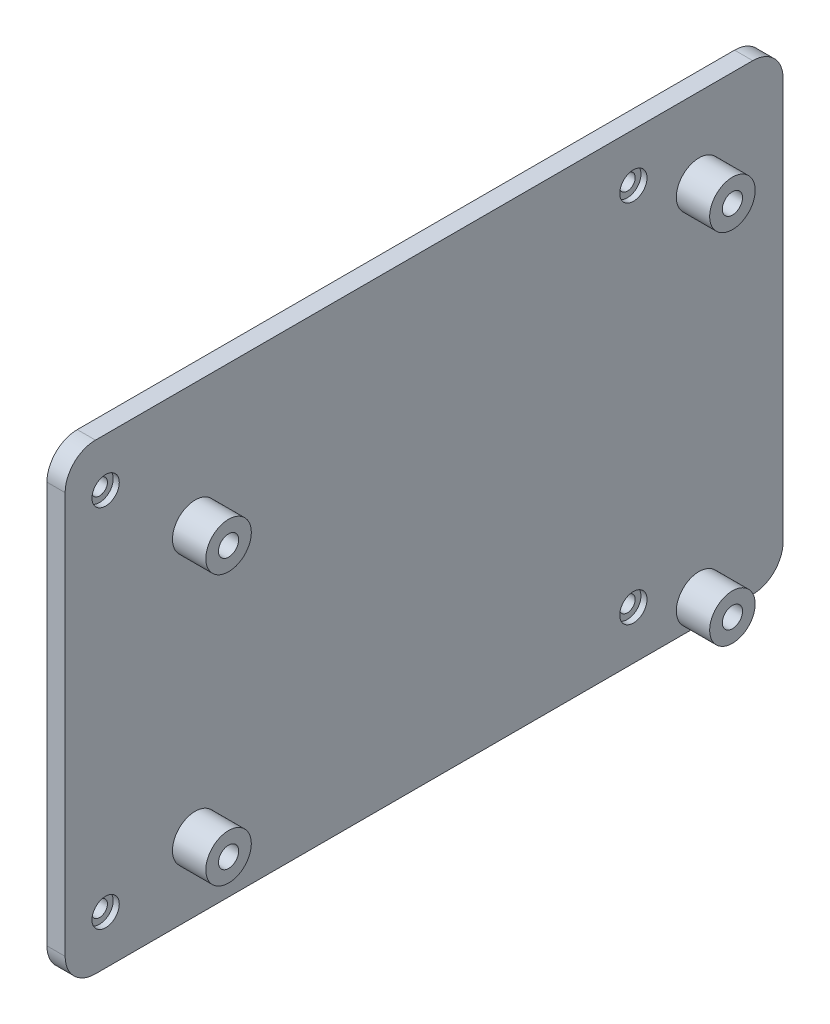
ISO-10303-21;
HEADER;
FILE_DESCRIPTION(('STEP AP214'),'2;1');
FILE_NAME('part.step','',(''),(''),'','','');
FILE_SCHEMA(('AUTOMOTIVE_DESIGN { 1 0 10303 214 1 1 1 1 }'));
ENDSEC;
DATA;
#1=APPLICATION_CONTEXT('core data for automotive mechanical design processes');
#2=APPLICATION_PROTOCOL_DEFINITION('international standard','automotive_design',2000,#1);
#3=PRODUCT_CONTEXT('',#1,'mechanical');
#4=PRODUCT('Part','Part','',(#3));
#5=PRODUCT_RELATED_PRODUCT_CATEGORY('part','',(#4));
#6=PRODUCT_DEFINITION_FORMATION('','',#4);
#7=PRODUCT_DEFINITION_CONTEXT('part definition',#1,'design');
#8=PRODUCT_DEFINITION('design','',#6,#7);
#9=PRODUCT_DEFINITION_SHAPE('','',#8);
#10=(LENGTH_UNIT() NAMED_UNIT(*) SI_UNIT(.MILLI.,.METRE.));
#11=(NAMED_UNIT(*) PLANE_ANGLE_UNIT() SI_UNIT($,.RADIAN.));
#12=(NAMED_UNIT(*) SI_UNIT($,.STERADIAN.) SOLID_ANGLE_UNIT());
#13=UNCERTAINTY_MEASURE_WITH_UNIT(LENGTH_MEASURE(1.E-05),#10,'distance_accuracy_value','');
#14=(GEOMETRIC_REPRESENTATION_CONTEXT(3) GLOBAL_UNCERTAINTY_ASSIGNED_CONTEXT((#13)) GLOBAL_UNIT_ASSIGNED_CONTEXT((#10,
#11,#12)) REPRESENTATION_CONTEXT('',''));
#15=CARTESIAN_POINT('',(0.,0.,0.));
#16=DIRECTION('',(0.,0.,1.));
#17=DIRECTION('',(1.,0.,0.));
#18=AXIS2_PLACEMENT_3D('',#15,#16,#17);
#19=CARTESIAN_POINT('',(3.,-30.0999999999989,-42.0000000000002));
#20=DIRECTION('',(1.,0.,0.));
#21=DIRECTION('',(0.,0.,-1.));
#22=AXIS2_PLACEMENT_3D('',#19,#20,#21);
#23=CYLINDRICAL_SURFACE('',#22,1.3);
#24=CARTESIAN_POINT('',(0.,-30.0999999999989,-42.0000000000002));
#25=DIRECTION('',(1.,0.,0.));
#26=DIRECTION('',(0.,0.,-1.));
#27=AXIS2_PLACEMENT_3D('',#24,#25,#26);
#28=CIRCLE('',#27,1.3);
#29=CARTESIAN_POINT('',(0.,-30.0999999999989,-43.3000000000002));
#30=VERTEX_POINT('',#29);
#31=EDGE_CURVE('E131',#30,#30,#28,.T.);
#32=ORIENTED_EDGE('',*,*,#31,.F.);
#33=EDGE_LOOP('',(#32));
#34=FACE_BOUND('',#33,.T.);
#35=CARTESIAN_POINT('',(2.,-30.0999999999989,-42.0000000000002));
#36=DIRECTION('',(1.,0.,0.));
#37=DIRECTION('',(0.,0.,-1.));
#38=AXIS2_PLACEMENT_3D('',#35,#36,#37);
#39=CIRCLE('',#38,1.3);
#40=CARTESIAN_POINT('',(2.,-30.0999999999989,-43.3000000000002));
#41=VERTEX_POINT('',#40);
#42=EDGE_CURVE('E40',#41,#41,#39,.F.);
#43=ORIENTED_EDGE('',*,*,#42,.F.);
#44=EDGE_LOOP('',(#43));
#45=FACE_BOUND('',#44,.T.);
#46=ADVANCED_FACE('F36',(#34,#45),#23,.F.);
#47=CARTESIAN_POINT('',(3.,30.1000000000011,-42.0000000000002));
#48=DIRECTION('',(1.,0.,0.));
#49=DIRECTION('',(0.,0.,-1.));
#50=AXIS2_PLACEMENT_3D('',#47,#48,#49);
#51=CYLINDRICAL_SURFACE('',#50,1.3);
#52=CARTESIAN_POINT('',(0.,30.1000000000011,-42.0000000000002));
#53=DIRECTION('',(1.,0.,0.));
#54=DIRECTION('',(0.,0.,-1.));
#55=AXIS2_PLACEMENT_3D('',#52,#53,#54);
#56=CIRCLE('',#55,1.3);
#57=CARTESIAN_POINT('',(0.,30.1000000000011,-43.3000000000002));
#58=VERTEX_POINT('',#57);
#59=EDGE_CURVE('E137',#58,#58,#56,.T.);
#60=ORIENTED_EDGE('',*,*,#59,.F.);
#61=EDGE_LOOP('',(#60));
#62=FACE_BOUND('',#61,.T.);
#63=CARTESIAN_POINT('',(2.,30.1000000000011,-42.0000000000002));
#64=DIRECTION('',(1.,0.,0.));
#65=DIRECTION('',(0.,0.,-1.));
#66=AXIS2_PLACEMENT_3D('',#63,#64,#65);
#67=CIRCLE('',#66,1.3);
#68=CARTESIAN_POINT('',(2.,30.1000000000011,-43.3000000000002));
#69=VERTEX_POINT('',#68);
#70=EDGE_CURVE('E182',#69,#69,#67,.F.);
#71=ORIENTED_EDGE('',*,*,#70,.F.);
#72=EDGE_LOOP('',(#71));
#73=FACE_BOUND('',#72,.T.);
#74=ADVANCED_FACE('F271',(#62,#73),#51,.F.);
#75=CARTESIAN_POINT('',(3.,30.1000000000011,44.9999999999998));
#76=DIRECTION('',(1.,0.,0.));
#77=DIRECTION('',(0.,0.,-1.));
#78=AXIS2_PLACEMENT_3D('',#75,#76,#77);
#79=CYLINDRICAL_SURFACE('',#78,1.3);
#80=CARTESIAN_POINT('',(0.,30.1000000000011,44.9999999999998));
#81=DIRECTION('',(1.,0.,0.));
#82=DIRECTION('',(0.,0.,-1.));
#83=AXIS2_PLACEMENT_3D('',#80,#81,#82);
#84=CIRCLE('',#83,1.3);
#85=CARTESIAN_POINT('',(0.,30.1000000000011,43.6999999999998));
#86=VERTEX_POINT('',#85);
#87=EDGE_CURVE('E238',#86,#86,#84,.T.);
#88=ORIENTED_EDGE('',*,*,#87,.F.);
#89=EDGE_LOOP('',(#88));
#90=FACE_BOUND('',#89,.T.);
#91=CARTESIAN_POINT('',(2.,30.1000000000011,44.9999999999998));
#92=DIRECTION('',(1.,0.,0.));
#93=DIRECTION('',(0.,0.,-1.));
#94=AXIS2_PLACEMENT_3D('',#91,#92,#93);
#95=CIRCLE('',#94,1.3);
#96=CARTESIAN_POINT('',(2.,30.1000000000011,43.6999999999998));
#97=VERTEX_POINT('',#96);
#98=EDGE_CURVE('E179',#97,#97,#95,.F.);
#99=ORIENTED_EDGE('',*,*,#98,.F.);
#100=EDGE_LOOP('',(#99));
#101=FACE_BOUND('',#100,.T.);
#102=ADVANCED_FACE('F277',(#90,#101),#79,.F.);
#103=CARTESIAN_POINT('',(3.,-30.0999999999989,44.9999999999998));
#104=DIRECTION('',(1.,0.,0.));
#105=DIRECTION('',(0.,0.,-1.));
#106=AXIS2_PLACEMENT_3D('',#103,#104,#105);
#107=CYLINDRICAL_SURFACE('',#106,1.3);
#108=CARTESIAN_POINT('',(0.,-30.0999999999989,44.9999999999998));
#109=DIRECTION('',(1.,0.,0.));
#110=DIRECTION('',(0.,0.,-1.));
#111=AXIS2_PLACEMENT_3D('',#108,#109,#110);
#112=CIRCLE('',#111,1.3);
#113=CARTESIAN_POINT('',(0.,-30.0999999999989,43.6999999999998));
#114=VERTEX_POINT('',#113);
#115=EDGE_CURVE('E233',#114,#114,#112,.T.);
#116=ORIENTED_EDGE('',*,*,#115,.F.);
#117=EDGE_LOOP('',(#116));
#118=FACE_BOUND('',#117,.T.);
#119=CARTESIAN_POINT('',(2.,-30.0999999999989,44.9999999999998));
#120=DIRECTION('',(1.,0.,0.));
#121=DIRECTION('',(0.,0.,-1.));
#122=AXIS2_PLACEMENT_3D('',#119,#120,#121);
#123=CIRCLE('',#122,1.3);
#124=CARTESIAN_POINT('',(2.,-30.0999999999989,43.6999999999998));
#125=VERTEX_POINT('',#124);
#126=EDGE_CURVE('E176',#125,#125,#123,.F.);
#127=ORIENTED_EDGE('',*,*,#126,.F.);
#128=EDGE_LOOP('',(#127));
#129=FACE_BOUND('',#128,.T.);
#130=ADVANCED_FACE('F298',(#118,#129),#107,.F.);
#131=CARTESIAN_POINT('',(3.,38.1,-66.675));
#132=DIRECTION('',(0.,0.,1.));
#133=DIRECTION('',(1.,0.,0.));
#134=AXIS2_PLACEMENT_3D('',#131,#132,#133);
#135=PLANE('',#134);
#136=DIRECTION('',(0.,1.,0.));
#137=VECTOR('',#136,1.);
#138=CARTESIAN_POINT('',(3.,38.1,-66.675));
#139=LINE('',#138,#137);
#140=CARTESIAN_POINT('',(3.,-33.1,-66.675));
#141=VERTEX_POINT('',#140);
#142=CARTESIAN_POINT('',(3.,33.1,-66.675));
#143=VERTEX_POINT('',#142);
#144=EDGE_CURVE('E124',#141,#143,#139,.T.);
#145=ORIENTED_EDGE('',*,*,#144,.F.);
#146=DIRECTION('',(-1.,0.,0.));
#147=VECTOR('',#146,1.);
#148=CARTESIAN_POINT('',(3.,-33.1,-66.675));
#149=LINE('',#148,#147);
#150=CARTESIAN_POINT('',(0.,-33.1,-66.675));
#151=VERTEX_POINT('',#150);
#152=EDGE_CURVE('E109',#141,#151,#149,.T.);
#153=ORIENTED_EDGE('',*,*,#152,.T.);
#154=DIRECTION('',(0.,1.,0.));
#155=VECTOR('',#154,1.);
#156=CARTESIAN_POINT('',(0.,38.1,-66.675));
#157=LINE('',#156,#155);
#158=CARTESIAN_POINT('',(0.,33.1,-66.675));
#159=VERTEX_POINT('',#158);
#160=EDGE_CURVE('E122',#151,#159,#157,.T.);
#161=ORIENTED_EDGE('',*,*,#160,.T.);
#162=DIRECTION('',(-1.,0.,0.));
#163=VECTOR('',#162,1.);
#164=CARTESIAN_POINT('',(3.,33.1,-66.675));
#165=LINE('',#164,#163);
#166=EDGE_CURVE('E126',#159,#143,#165,.F.);
#167=ORIENTED_EDGE('',*,*,#166,.T.);
#168=EDGE_LOOP('',(#145,#153,#161,#167));
#169=FACE_BOUND('',#168,.T.);
#170=ADVANCED_FACE('F121',(#169),#135,.F.);
#171=CARTESIAN_POINT('',(3.,38.1,66.675));
#172=DIRECTION('',(0.,-1.,0.));
#173=DIRECTION('',(0.,0.,-1.));
#174=AXIS2_PLACEMENT_3D('',#171,#172,#173);
#175=PLANE('',#174);
#176=DIRECTION('',(0.,0.,1.));
#177=VECTOR('',#176,1.);
#178=CARTESIAN_POINT('',(3.,38.1,66.675));
#179=LINE('',#178,#177);
#180=CARTESIAN_POINT('',(3.,38.1,-61.675));
#181=VERTEX_POINT('',#180);
#182=CARTESIAN_POINT('',(3.,38.1,46.675));
#183=VERTEX_POINT('',#182);
#184=EDGE_CURVE('E243',#181,#183,#179,.T.);
#185=ORIENTED_EDGE('',*,*,#184,.F.);
#186=DIRECTION('',(-1.,0.,0.));
#187=VECTOR('',#186,1.);
#188=CARTESIAN_POINT('',(3.,38.1,-61.675));
#189=LINE('',#188,#187);
#190=CARTESIAN_POINT('',(0.,38.1,-61.675));
#191=VERTEX_POINT('',#190);
#192=EDGE_CURVE('E171',#181,#191,#189,.T.);
#193=ORIENTED_EDGE('',*,*,#192,.T.);
#194=DIRECTION('',(0.,0.,1.));
#195=VECTOR('',#194,1.);
#196=CARTESIAN_POINT('',(0.,38.1,66.675));
#197=LINE('',#196,#195);
#198=CARTESIAN_POINT('',(0.,38.1,46.675));
#199=VERTEX_POINT('',#198);
#200=EDGE_CURVE('E130',#191,#199,#197,.T.);
#201=ORIENTED_EDGE('',*,*,#200,.T.);
#202=DIRECTION('',(1.,0.,0.));
#203=VECTOR('',#202,1.);
#204=CARTESIAN_POINT('',(3.,38.1,46.675));
#205=LINE('',#204,#203);
#206=EDGE_CURVE('E169',#199,#183,#205,.T.);
#207=ORIENTED_EDGE('',*,*,#206,.T.);
#208=EDGE_LOOP('',(#185,#193,#201,#207));
#209=FACE_BOUND('',#208,.T.);
#210=ADVANCED_FACE('F259',(#209),#175,.F.);
#211=CARTESIAN_POINT('',(3.,-38.1,66.675));
#212=DIRECTION('',(0.,1.,0.));
#213=DIRECTION('',(0.,0.,1.));
#214=AXIS2_PLACEMENT_3D('',#211,#212,#213);
#215=PLANE('',#214);
#216=DIRECTION('',(0.,0.,-1.));
#217=VECTOR('',#216,1.);
#218=CARTESIAN_POINT('',(0.,-38.1,66.675));
#219=LINE('',#218,#217);
#220=CARTESIAN_POINT('',(0.,-38.1,46.675));
#221=VERTEX_POINT('',#220);
#222=CARTESIAN_POINT('',(0.,-38.1,-61.675));
#223=VERTEX_POINT('',#222);
#224=EDGE_CURVE('E134',#221,#223,#219,.T.);
#225=ORIENTED_EDGE('',*,*,#224,.T.);
#226=DIRECTION('',(-1.,0.,0.));
#227=VECTOR('',#226,1.);
#228=CARTESIAN_POINT('',(3.,-38.1,-61.675));
#229=LINE('',#228,#227);
#230=CARTESIAN_POINT('',(3.,-38.1,-61.675));
#231=VERTEX_POINT('',#230);
#232=EDGE_CURVE('E110',#223,#231,#229,.F.);
#233=ORIENTED_EDGE('',*,*,#232,.T.);
#234=DIRECTION('',(0.,0.,-1.));
#235=VECTOR('',#234,1.);
#236=CARTESIAN_POINT('',(3.,-38.1,66.675));
#237=LINE('',#236,#235);
#238=CARTESIAN_POINT('',(3.,-38.1,46.675));
#239=VERTEX_POINT('',#238);
#240=EDGE_CURVE('E140',#239,#231,#237,.T.);
#241=ORIENTED_EDGE('',*,*,#240,.F.);
#242=DIRECTION('',(1.,0.,0.));
#243=VECTOR('',#242,1.);
#244=CARTESIAN_POINT('',(3.,-38.1,46.675));
#245=LINE('',#244,#243);
#246=EDGE_CURVE('E115',#239,#221,#245,.F.);
#247=ORIENTED_EDGE('',*,*,#246,.T.);
#248=EDGE_LOOP('',(#225,#233,#241,#247));
#249=FACE_BOUND('',#248,.T.);
#250=ADVANCED_FACE('F250',(#249),#215,.F.);
#251=CARTESIAN_POINT('',(3.,0.,0.));
#252=DIRECTION('',(1.,0.,0.));
#253=DIRECTION('',(0.,0.,-1.));
#254=AXIS2_PLACEMENT_3D('',#251,#252,#253);
#255=PLANE('',#254);
#256=CARTESIAN_POINT('',(3.,-30.0999999999989,-42.0000000000002));
#257=DIRECTION('',(1.,0.,0.));
#258=DIRECTION('',(0.,0.,-1.));
#259=AXIS2_PLACEMENT_3D('',#256,#257,#258);
#260=CIRCLE('',#259,2.25);
#261=CARTESIAN_POINT('',(3.,-30.0999999999989,-44.2500000000002));
#262=VERTEX_POINT('',#261);
#263=EDGE_CURVE('E417',#262,#262,#260,.T.);
#264=ORIENTED_EDGE('',*,*,#263,.F.);
#265=EDGE_LOOP('',(#264));
#266=FACE_BOUND('',#265,.T.);
#267=CARTESIAN_POINT('',(3.,30.1000000000011,-42.0000000000002));
#268=DIRECTION('',(1.,0.,0.));
#269=DIRECTION('',(0.,0.,-1.));
#270=AXIS2_PLACEMENT_3D('',#267,#268,#269);
#271=CIRCLE('',#270,2.25);
#272=CARTESIAN_POINT('',(3.,30.1000000000011,-44.2500000000002));
#273=VERTEX_POINT('',#272);
#274=EDGE_CURVE('E411',#273,#273,#271,.T.);
#275=ORIENTED_EDGE('',*,*,#274,.F.);
#276=EDGE_LOOP('',(#275));
#277=FACE_BOUND('',#276,.T.);
#278=CARTESIAN_POINT('',(3.,30.1000000000011,44.9999999999998));
#279=DIRECTION('',(1.,0.,0.));
#280=DIRECTION('',(0.,0.,-1.));
#281=AXIS2_PLACEMENT_3D('',#278,#279,#280);
#282=CIRCLE('',#281,2.25);
#283=CARTESIAN_POINT('',(3.,30.1000000000011,42.7499999999998));
#284=VERTEX_POINT('',#283);
#285=EDGE_CURVE('E402',#284,#284,#282,.T.);
#286=ORIENTED_EDGE('',*,*,#285,.F.);
#287=EDGE_LOOP('',(#286));
#288=FACE_BOUND('',#287,.T.);
#289=CARTESIAN_POINT('',(3.,-30.0999999999989,44.9999999999998));
#290=DIRECTION('',(1.,0.,0.));
#291=DIRECTION('',(0.,0.,-1.));
#292=AXIS2_PLACEMENT_3D('',#289,#290,#291);
#293=CIRCLE('',#292,2.25);
#294=CARTESIAN_POINT('',(3.,-30.0999999999989,42.7499999999998));
#295=VERTEX_POINT('',#294);
#296=EDGE_CURVE('E401',#295,#295,#293,.T.);
#297=ORIENTED_EDGE('',*,*,#296,.F.);
#298=EDGE_LOOP('',(#297));
#299=FACE_BOUND('',#298,.T.);
#300=ORIENTED_EDGE('',*,*,#240,.T.);
#301=CARTESIAN_POINT('',(3.,-33.1,-61.675));
#302=DIRECTION('',(1.,0.,0.));
#303=DIRECTION('',(0.,0.,-1.));
#304=AXIS2_PLACEMENT_3D('',#301,#302,#303);
#305=CIRCLE('',#304,5.);
#306=EDGE_CURVE('E167',#231,#141,#305,.T.);
#307=ORIENTED_EDGE('',*,*,#306,.T.);
#308=ORIENTED_EDGE('',*,*,#144,.T.);
#309=CARTESIAN_POINT('',(3.,33.1,-61.675));
#310=DIRECTION('',(1.,0.,0.));
#311=DIRECTION('',(0.,0.,-1.));
#312=AXIS2_PLACEMENT_3D('',#309,#310,#311);
#313=CIRCLE('',#312,5.);
#314=EDGE_CURVE('E61',#143,#181,#313,.T.);
#315=ORIENTED_EDGE('',*,*,#314,.T.);
#316=ORIENTED_EDGE('',*,*,#184,.T.);
#317=CARTESIAN_POINT('',(3.,33.1,46.675));
#318=DIRECTION('',(1.,0.,0.));
#319=DIRECTION('',(0.,0.,-1.));
#320=AXIS2_PLACEMENT_3D('',#317,#318,#319);
#321=CIRCLE('',#320,5.);
#322=CARTESIAN_POINT('',(3.,33.1,51.675));
#323=VERTEX_POINT('',#322);
#324=EDGE_CURVE('E53',#183,#323,#321,.T.);
#325=ORIENTED_EDGE('',*,*,#324,.T.);
#326=DIRECTION('',(0.,1.,0.));
#327=VECTOR('',#326,1.);
#328=CARTESIAN_POINT('',(3.,0.,51.675));
#329=LINE('',#328,#327);
#330=CARTESIAN_POINT('',(3.,-33.1,51.675));
#331=VERTEX_POINT('',#330);
#332=EDGE_CURVE('E187',#331,#323,#329,.T.);
#333=ORIENTED_EDGE('',*,*,#332,.F.);
#334=CARTESIAN_POINT('',(3.,-33.1,46.675));
#335=DIRECTION('',(1.,0.,0.));
#336=DIRECTION('',(0.,0.,-1.));
#337=AXIS2_PLACEMENT_3D('',#334,#335,#336);
#338=CIRCLE('',#337,5.);
#339=EDGE_CURVE('E163',#331,#239,#338,.T.);
#340=ORIENTED_EDGE('',*,*,#339,.T.);
#341=EDGE_LOOP('',(#300,#307,#308,#315,#316,#325,#333,#340));
#342=FACE_BOUND('',#341,.T.);
#343=CARTESIAN_POINT('',(3.,-26.854999995946,30.2315030100667));
#344=DIRECTION('',(1.,0.,0.));
#345=DIRECTION('',(0.,0.,-1.));
#346=AXIS2_PLACEMENT_3D('',#343,#344,#345);
#347=CIRCLE('',#346,3.75000000000028);
#348=CARTESIAN_POINT('',(3.,-26.854999995946,26.4815030100664));
#349=VERTEX_POINT('',#348);
#350=EDGE_CURVE('E196',#349,#349,#347,.T.);
#351=ORIENTED_EDGE('',*,*,#350,.F.);
#352=EDGE_LOOP('',(#351));
#353=FACE_BOUND('',#352,.T.);
#354=CARTESIAN_POINT('',(3.,17.584000004054,30.2315030100668));
#355=DIRECTION('',(1.,0.,0.));
#356=DIRECTION('',(0.,0.,-1.));
#357=AXIS2_PLACEMENT_3D('',#354,#355,#356);
#358=CIRCLE('',#357,3.75000000000028);
#359=CARTESIAN_POINT('',(3.,17.584000004054,26.4815030100665));
#360=VERTEX_POINT('',#359);
#361=EDGE_CURVE('E206',#360,#360,#358,.T.);
#362=ORIENTED_EDGE('',*,*,#361,.F.);
#363=EDGE_LOOP('',(#362));
#364=FACE_BOUND('',#363,.T.);
#365=CARTESIAN_POINT('',(3.,24.8950000040542,-52.8264969899332));
#366=DIRECTION('',(1.,0.,0.));
#367=DIRECTION('',(0.,0.,-1.));
#368=AXIS2_PLACEMENT_3D('',#365,#366,#367);
#369=CIRCLE('',#368,3.75000000000028);
#370=CARTESIAN_POINT('',(3.,24.8950000040542,-56.5764969899334));
#371=VERTEX_POINT('',#370);
#372=EDGE_CURVE('E215',#371,#371,#369,.T.);
#373=ORIENTED_EDGE('',*,*,#372,.F.);
#374=EDGE_LOOP('',(#373));
#375=FACE_BOUND('',#374,.T.);
#376=CARTESIAN_POINT('',(3.,-34.1629999959458,-52.8264969899334));
#377=DIRECTION('',(1.,0.,0.));
#378=DIRECTION('',(0.,0.,-1.));
#379=AXIS2_PLACEMENT_3D('',#376,#377,#378);
#380=CIRCLE('',#379,3.75000000000028);
#381=CARTESIAN_POINT('',(3.,-34.1629999959458,-56.5764969899336));
#382=VERTEX_POINT('',#381);
#383=EDGE_CURVE('E224',#382,#382,#380,.T.);
#384=ORIENTED_EDGE('',*,*,#383,.F.);
#385=EDGE_LOOP('',(#384));
#386=FACE_BOUND('',#385,.T.);
#387=ADVANCED_FACE('F246',(#266,#277,#288,#299,#342,#353,#364,#375,#386),#255,.T.);
#388=CARTESIAN_POINT('',(0.,0.,0.));
#389=DIRECTION('',(1.,0.,0.));
#390=DIRECTION('',(0.,0.,-1.));
#391=AXIS2_PLACEMENT_3D('',#388,#389,#390);
#392=PLANE('',#391);
#393=ORIENTED_EDGE('',*,*,#115,.T.);
#394=EDGE_LOOP('',(#393));
#395=FACE_BOUND('',#394,.T.);
#396=ORIENTED_EDGE('',*,*,#87,.T.);
#397=EDGE_LOOP('',(#396));
#398=FACE_BOUND('',#397,.T.);
#399=ORIENTED_EDGE('',*,*,#59,.T.);
#400=EDGE_LOOP('',(#399));
#401=FACE_BOUND('',#400,.T.);
#402=ORIENTED_EDGE('',*,*,#31,.T.);
#403=EDGE_LOOP('',(#402));
#404=FACE_BOUND('',#403,.T.);
#405=ORIENTED_EDGE('',*,*,#160,.F.);
#406=CARTESIAN_POINT('',(0.,-33.1,-61.675));
#407=DIRECTION('',(1.,0.,0.));
#408=DIRECTION('',(0.,0.,-1.));
#409=AXIS2_PLACEMENT_3D('',#406,#407,#408);
#410=CIRCLE('',#409,5.);
#411=EDGE_CURVE('E105',#151,#223,#410,.F.);
#412=ORIENTED_EDGE('',*,*,#411,.T.);
#413=ORIENTED_EDGE('',*,*,#224,.F.);
#414=CARTESIAN_POINT('',(0.,-33.1,46.675));
#415=DIRECTION('',(1.,0.,0.));
#416=DIRECTION('',(0.,0.,-1.));
#417=AXIS2_PLACEMENT_3D('',#414,#415,#416);
#418=CIRCLE('',#417,5.);
#419=CARTESIAN_POINT('',(0.,-33.1,51.675));
#420=VERTEX_POINT('',#419);
#421=EDGE_CURVE('E125',#221,#420,#418,.F.);
#422=ORIENTED_EDGE('',*,*,#421,.T.);
#423=DIRECTION('',(0.,1.,0.));
#424=VECTOR('',#423,1.);
#425=CARTESIAN_POINT('',(0.,0.,51.675));
#426=LINE('',#425,#424);
#427=CARTESIAN_POINT('',(0.,33.1,51.675));
#428=VERTEX_POINT('',#427);
#429=EDGE_CURVE('E191',#420,#428,#426,.T.);
#430=ORIENTED_EDGE('',*,*,#429,.T.);
#431=CARTESIAN_POINT('',(0.,33.1,46.675));
#432=DIRECTION('',(1.,0.,0.));
#433=DIRECTION('',(0.,0.,-1.));
#434=AXIS2_PLACEMENT_3D('',#431,#432,#433);
#435=CIRCLE('',#434,5.);
#436=EDGE_CURVE('E158',#428,#199,#435,.F.);
#437=ORIENTED_EDGE('',*,*,#436,.T.);
#438=ORIENTED_EDGE('',*,*,#200,.F.);
#439=CARTESIAN_POINT('',(0.,33.1,-61.675));
#440=DIRECTION('',(1.,0.,0.));
#441=DIRECTION('',(0.,0.,-1.));
#442=AXIS2_PLACEMENT_3D('',#439,#440,#441);
#443=CIRCLE('',#442,5.);
#444=EDGE_CURVE('E116',#191,#159,#443,.F.);
#445=ORIENTED_EDGE('',*,*,#444,.T.);
#446=EDGE_LOOP('',(#405,#412,#413,#422,#430,#437,#438,#445));
#447=FACE_BOUND('',#446,.T.);
#448=ADVANCED_FACE('F128',(#395,#398,#401,#404,#447),#392,.F.);
#449=CARTESIAN_POINT('',(8.5,-34.1629999959458,-52.8264969899334));
#450=DIRECTION('',(-1.,0.,0.));
#451=DIRECTION('',(0.,0.,1.));
#452=AXIS2_PLACEMENT_3D('',#449,#450,#451);
#453=CYLINDRICAL_SURFACE('',#452,1.66499999999974);
#454=CARTESIAN_POINT('',(8.5,-34.1629999959458,-52.8264969899334));
#455=DIRECTION('',(1.,0.,0.));
#456=DIRECTION('',(0.,0.,-1.));
#457=AXIS2_PLACEMENT_3D('',#454,#455,#456);
#458=CIRCLE('',#457,1.66499999999974);
#459=CARTESIAN_POINT('',(8.5,-34.1629999959458,-54.4914969899331));
#460=VERTEX_POINT('',#459);
#461=EDGE_CURVE('E227',#460,#460,#458,.T.);
#462=ORIENTED_EDGE('',*,*,#461,.T.);
#463=EDGE_LOOP('',(#462));
#464=FACE_BOUND('',#463,.T.);
#465=CARTESIAN_POINT('',(3.,-34.1629999959458,-52.8264969899334));
#466=DIRECTION('',(1.,0.,0.));
#467=DIRECTION('',(0.,0.,-1.));
#468=AXIS2_PLACEMENT_3D('',#465,#466,#467);
#469=CIRCLE('',#468,1.66499999999974);
#470=CARTESIAN_POINT('',(3.,-34.1629999959458,-54.4914969899331));
#471=VERTEX_POINT('',#470);
#472=EDGE_CURVE('E144',#471,#471,#469,.F.);
#473=ORIENTED_EDGE('',*,*,#472,.T.);
#474=EDGE_LOOP('',(#473));
#475=FACE_BOUND('',#474,.T.);
#476=ADVANCED_FACE('F291',(#464,#475),#453,.F.);
#477=CARTESIAN_POINT('',(8.5,-34.1629999959458,-52.8264969899334));
#478=DIRECTION('',(-1.,0.,0.));
#479=DIRECTION('',(0.,0.,1.));
#480=AXIS2_PLACEMENT_3D('',#477,#478,#479);
#481=CYLINDRICAL_SURFACE('',#480,3.75000000000028);
#482=CARTESIAN_POINT('',(8.5,-34.1629999959458,-52.8264969899334));
#483=DIRECTION('',(1.,0.,0.));
#484=DIRECTION('',(0.,0.,-1.));
#485=AXIS2_PLACEMENT_3D('',#482,#483,#484);
#486=CIRCLE('',#485,3.75000000000028);
#487=CARTESIAN_POINT('',(8.5,-34.1629999959458,-56.5764969899336));
#488=VERTEX_POINT('',#487);
#489=EDGE_CURVE('E230',#488,#488,#486,.T.);
#490=ORIENTED_EDGE('',*,*,#489,.F.);
#491=EDGE_LOOP('',(#490));
#492=FACE_BOUND('',#491,.T.);
#493=ORIENTED_EDGE('',*,*,#383,.T.);
#494=EDGE_LOOP('',(#493));
#495=FACE_BOUND('',#494,.T.);
#496=ADVANCED_FACE('F313',(#492,#495),#481,.T.);
#497=CARTESIAN_POINT('',(8.5,0.,0.));
#498=DIRECTION('',(1.,0.,0.));
#499=DIRECTION('',(0.,0.,-1.));
#500=AXIS2_PLACEMENT_3D('',#497,#498,#499);
#501=PLANE('',#500);
#502=ORIENTED_EDGE('',*,*,#461,.F.);
#503=EDGE_LOOP('',(#502));
#504=FACE_BOUND('',#503,.T.);
#505=ORIENTED_EDGE('',*,*,#489,.T.);
#506=EDGE_LOOP('',(#505));
#507=FACE_BOUND('',#506,.T.);
#508=ADVANCED_FACE('F317',(#504,#507),#501,.T.);
#509=ORIENTED_EDGE('',*,*,#472,.F.);
#510=EDGE_LOOP('',(#509));
#511=FACE_BOUND('',#510,.T.);
#512=ADVANCED_FACE('F288',(#511),#255,.T.);
#513=CARTESIAN_POINT('',(8.5,24.8950000040542,-52.8264969899332));
#514=DIRECTION('',(-1.,0.,0.));
#515=DIRECTION('',(0.,0.,1.));
#516=AXIS2_PLACEMENT_3D('',#513,#514,#515);
#517=CYLINDRICAL_SURFACE('',#516,1.66499999999974);
#518=CARTESIAN_POINT('',(8.5,24.8950000040542,-52.8264969899332));
#519=DIRECTION('',(1.,0.,0.));
#520=DIRECTION('',(0.,0.,-1.));
#521=AXIS2_PLACEMENT_3D('',#518,#519,#520);
#522=CIRCLE('',#521,1.66499999999974);
#523=CARTESIAN_POINT('',(8.5,24.8950000040542,-54.4914969899329));
#524=VERTEX_POINT('',#523);
#525=EDGE_CURVE('E218',#524,#524,#522,.T.);
#526=ORIENTED_EDGE('',*,*,#525,.T.);
#527=EDGE_LOOP('',(#526));
#528=FACE_BOUND('',#527,.T.);
#529=CARTESIAN_POINT('',(3.,24.8950000040542,-52.8264969899332));
#530=DIRECTION('',(1.,0.,0.));
#531=DIRECTION('',(0.,0.,-1.));
#532=AXIS2_PLACEMENT_3D('',#529,#530,#531);
#533=CIRCLE('',#532,1.66499999999974);
#534=CARTESIAN_POINT('',(3.,24.8950000040542,-54.4914969899329));
#535=VERTEX_POINT('',#534);
#536=EDGE_CURVE('E147',#535,#535,#533,.F.);
#537=ORIENTED_EDGE('',*,*,#536,.T.);
#538=EDGE_LOOP('',(#537));
#539=FACE_BOUND('',#538,.T.);
#540=ADVANCED_FACE('F322',(#528,#539),#517,.F.);
#541=CARTESIAN_POINT('',(8.5,24.8950000040542,-52.8264969899332));
#542=DIRECTION('',(-1.,0.,0.));
#543=DIRECTION('',(0.,0.,1.));
#544=AXIS2_PLACEMENT_3D('',#541,#542,#543);
#545=CYLINDRICAL_SURFACE('',#544,3.75000000000028);
#546=CARTESIAN_POINT('',(8.5,24.8950000040542,-52.8264969899332));
#547=DIRECTION('',(1.,0.,0.));
#548=DIRECTION('',(0.,0.,-1.));
#549=AXIS2_PLACEMENT_3D('',#546,#547,#548);
#550=CIRCLE('',#549,3.75000000000028);
#551=CARTESIAN_POINT('',(8.5,24.8950000040542,-56.5764969899334));
#552=VERTEX_POINT('',#551);
#553=EDGE_CURVE('E221',#552,#552,#550,.T.);
#554=ORIENTED_EDGE('',*,*,#553,.F.);
#555=EDGE_LOOP('',(#554));
#556=FACE_BOUND('',#555,.T.);
#557=ORIENTED_EDGE('',*,*,#372,.T.);
#558=EDGE_LOOP('',(#557));
#559=FACE_BOUND('',#558,.T.);
#560=ADVANCED_FACE('F325',(#556,#559),#545,.T.);
#561=CARTESIAN_POINT('',(8.5,0.,0.));
#562=DIRECTION('',(1.,0.,0.));
#563=DIRECTION('',(0.,0.,-1.));
#564=AXIS2_PLACEMENT_3D('',#561,#562,#563);
#565=PLANE('',#564);
#566=ORIENTED_EDGE('',*,*,#525,.F.);
#567=EDGE_LOOP('',(#566));
#568=FACE_BOUND('',#567,.T.);
#569=ORIENTED_EDGE('',*,*,#553,.T.);
#570=EDGE_LOOP('',(#569));
#571=FACE_BOUND('',#570,.T.);
#572=ADVANCED_FACE('F329',(#568,#571),#565,.T.);
#573=ORIENTED_EDGE('',*,*,#536,.F.);
#574=EDGE_LOOP('',(#573));
#575=FACE_BOUND('',#574,.T.);
#576=ADVANCED_FACE('F333',(#575),#255,.T.);
#577=CARTESIAN_POINT('',(8.5,17.584000004054,30.2315030100668));
#578=DIRECTION('',(-1.,0.,0.));
#579=DIRECTION('',(0.,0.,1.));
#580=AXIS2_PLACEMENT_3D('',#577,#578,#579);
#581=CYLINDRICAL_SURFACE('',#580,1.66499999999974);
#582=CARTESIAN_POINT('',(8.5,17.584000004054,30.2315030100668));
#583=DIRECTION('',(1.,0.,0.));
#584=DIRECTION('',(0.,0.,-1.));
#585=AXIS2_PLACEMENT_3D('',#582,#583,#584);
#586=CIRCLE('',#585,1.66499999999974);
#587=CARTESIAN_POINT('',(8.5,17.584000004054,28.5665030100671));
#588=VERTEX_POINT('',#587);
#589=EDGE_CURVE('E209',#588,#588,#586,.T.);
#590=ORIENTED_EDGE('',*,*,#589,.T.);
#591=EDGE_LOOP('',(#590));
#592=FACE_BOUND('',#591,.T.);
#593=CARTESIAN_POINT('',(3.,17.584000004054,30.2315030100668));
#594=DIRECTION('',(1.,0.,0.));
#595=DIRECTION('',(0.,0.,-1.));
#596=AXIS2_PLACEMENT_3D('',#593,#594,#595);
#597=CIRCLE('',#596,1.66499999999974);
#598=CARTESIAN_POINT('',(3.,17.584000004054,28.5665030100671));
#599=VERTEX_POINT('',#598);
#600=EDGE_CURVE('E150',#599,#599,#597,.F.);
#601=ORIENTED_EDGE('',*,*,#600,.T.);
#602=EDGE_LOOP('',(#601));
#603=FACE_BOUND('',#602,.T.);
#604=ADVANCED_FACE('F335',(#592,#603),#581,.F.);
#605=CARTESIAN_POINT('',(8.5,17.584000004054,30.2315030100668));
#606=DIRECTION('',(-1.,0.,0.));
#607=DIRECTION('',(0.,0.,1.));
#608=AXIS2_PLACEMENT_3D('',#605,#606,#607);
#609=CYLINDRICAL_SURFACE('',#608,3.75000000000028);
#610=CARTESIAN_POINT('',(8.5,17.584000004054,30.2315030100668));
#611=DIRECTION('',(1.,0.,0.));
#612=DIRECTION('',(0.,0.,-1.));
#613=AXIS2_PLACEMENT_3D('',#610,#611,#612);
#614=CIRCLE('',#613,3.75000000000028);
#615=CARTESIAN_POINT('',(8.5,17.584000004054,26.4815030100665));
#616=VERTEX_POINT('',#615);
#617=EDGE_CURVE('E212',#616,#616,#614,.T.);
#618=ORIENTED_EDGE('',*,*,#617,.F.);
#619=EDGE_LOOP('',(#618));
#620=FACE_BOUND('',#619,.T.);
#621=ORIENTED_EDGE('',*,*,#361,.T.);
#622=EDGE_LOOP('',(#621));
#623=FACE_BOUND('',#622,.T.);
#624=ADVANCED_FACE('F338',(#620,#623),#609,.T.);
#625=CARTESIAN_POINT('',(8.5,0.,0.));
#626=DIRECTION('',(1.,0.,0.));
#627=DIRECTION('',(0.,0.,-1.));
#628=AXIS2_PLACEMENT_3D('',#625,#626,#627);
#629=PLANE('',#628);
#630=ORIENTED_EDGE('',*,*,#589,.F.);
#631=EDGE_LOOP('',(#630));
#632=FACE_BOUND('',#631,.T.);
#633=ORIENTED_EDGE('',*,*,#617,.T.);
#634=EDGE_LOOP('',(#633));
#635=FACE_BOUND('',#634,.T.);
#636=ADVANCED_FACE('F342',(#632,#635),#629,.T.);
#637=ORIENTED_EDGE('',*,*,#600,.F.);
#638=EDGE_LOOP('',(#637));
#639=FACE_BOUND('',#638,.T.);
#640=ADVANCED_FACE('F346',(#639),#255,.T.);
#641=CARTESIAN_POINT('',(8.5,-26.854999995946,30.2315030100667));
#642=DIRECTION('',(-1.,0.,0.));
#643=DIRECTION('',(0.,0.,1.));
#644=AXIS2_PLACEMENT_3D('',#641,#642,#643);
#645=CYLINDRICAL_SURFACE('',#644,1.66499999999974);
#646=CARTESIAN_POINT('',(8.5,-26.854999995946,30.2315030100667));
#647=DIRECTION('',(1.,0.,0.));
#648=DIRECTION('',(0.,0.,-1.));
#649=AXIS2_PLACEMENT_3D('',#646,#647,#648);
#650=CIRCLE('',#649,1.66499999999974);
#651=CARTESIAN_POINT('',(8.5,-26.854999995946,28.5665030100669));
#652=VERTEX_POINT('',#651);
#653=EDGE_CURVE('E200',#652,#652,#650,.T.);
#654=ORIENTED_EDGE('',*,*,#653,.T.);
#655=EDGE_LOOP('',(#654));
#656=FACE_BOUND('',#655,.T.);
#657=CARTESIAN_POINT('',(3.,-26.854999995946,30.2315030100667));
#658=DIRECTION('',(1.,0.,0.));
#659=DIRECTION('',(0.,0.,-1.));
#660=AXIS2_PLACEMENT_3D('',#657,#658,#659);
#661=CIRCLE('',#660,1.66499999999974);
#662=CARTESIAN_POINT('',(3.,-26.854999995946,28.5665030100669));
#663=VERTEX_POINT('',#662);
#664=EDGE_CURVE('E153',#663,#663,#661,.F.);
#665=ORIENTED_EDGE('',*,*,#664,.T.);
#666=EDGE_LOOP('',(#665));
#667=FACE_BOUND('',#666,.T.);
#668=ADVANCED_FACE('F348',(#656,#667),#645,.F.);
#669=CARTESIAN_POINT('',(8.5,-26.854999995946,30.2315030100667));
#670=DIRECTION('',(-1.,0.,0.));
#671=DIRECTION('',(0.,0.,1.));
#672=AXIS2_PLACEMENT_3D('',#669,#670,#671);
#673=CYLINDRICAL_SURFACE('',#672,3.75000000000028);
#674=CARTESIAN_POINT('',(8.5,-26.854999995946,30.2315030100667));
#675=DIRECTION('',(1.,0.,0.));
#676=DIRECTION('',(0.,0.,-1.));
#677=AXIS2_PLACEMENT_3D('',#674,#675,#676);
#678=CIRCLE('',#677,3.75000000000028);
#679=CARTESIAN_POINT('',(8.5,-26.854999995946,26.4815030100664));
#680=VERTEX_POINT('',#679);
#681=EDGE_CURVE('E203',#680,#680,#678,.T.);
#682=ORIENTED_EDGE('',*,*,#681,.F.);
#683=EDGE_LOOP('',(#682));
#684=FACE_BOUND('',#683,.T.);
#685=ORIENTED_EDGE('',*,*,#350,.T.);
#686=EDGE_LOOP('',(#685));
#687=FACE_BOUND('',#686,.T.);
#688=ADVANCED_FACE('F351',(#684,#687),#673,.T.);
#689=CARTESIAN_POINT('',(8.5,0.,0.));
#690=DIRECTION('',(1.,0.,0.));
#691=DIRECTION('',(0.,0.,-1.));
#692=AXIS2_PLACEMENT_3D('',#689,#690,#691);
#693=PLANE('',#692);
#694=ORIENTED_EDGE('',*,*,#653,.F.);
#695=EDGE_LOOP('',(#694));
#696=FACE_BOUND('',#695,.T.);
#697=ORIENTED_EDGE('',*,*,#681,.T.);
#698=EDGE_LOOP('',(#697));
#699=FACE_BOUND('',#698,.T.);
#700=ADVANCED_FACE('F355',(#696,#699),#693,.T.);
#701=ORIENTED_EDGE('',*,*,#664,.F.);
#702=EDGE_LOOP('',(#701));
#703=FACE_BOUND('',#702,.T.);
#704=ADVANCED_FACE('F287',(#703),#255,.T.);
#705=CARTESIAN_POINT('',(0.,0.,51.675));
#706=DIRECTION('',(0.,0.,-1.));
#707=DIRECTION('',(0.,1.,0.));
#708=AXIS2_PLACEMENT_3D('',#705,#706,#707);
#709=PLANE('',#708);
#710=ORIENTED_EDGE('',*,*,#332,.T.);
#711=DIRECTION('',(1.,0.,0.));
#712=VECTOR('',#711,1.);
#713=CARTESIAN_POINT('',(0.,33.1,51.675));
#714=LINE('',#713,#712);
#715=EDGE_CURVE('E11',#323,#428,#714,.F.);
#716=ORIENTED_EDGE('',*,*,#715,.T.);
#717=ORIENTED_EDGE('',*,*,#429,.F.);
#718=DIRECTION('',(1.,0.,0.));
#719=VECTOR('',#718,1.);
#720=CARTESIAN_POINT('',(0.,-33.1,51.675));
#721=LINE('',#720,#719);
#722=EDGE_CURVE('E45',#420,#331,#721,.T.);
#723=ORIENTED_EDGE('',*,*,#722,.T.);
#724=EDGE_LOOP('',(#710,#716,#717,#723));
#725=FACE_BOUND('',#724,.T.);
#726=ADVANCED_FACE('F256',(#725),#709,.F.);
#727=CARTESIAN_POINT('',(3.,-33.1,-61.675));
#728=DIRECTION('',(-1.,0.,0.));
#729=DIRECTION('',(0.,0.,1.));
#730=AXIS2_PLACEMENT_3D('',#727,#728,#729);
#731=CYLINDRICAL_SURFACE('',#730,5.);
#732=ORIENTED_EDGE('',*,*,#306,.F.);
#733=ORIENTED_EDGE('',*,*,#232,.F.);
#734=ORIENTED_EDGE('',*,*,#411,.F.);
#735=ORIENTED_EDGE('',*,*,#152,.F.);
#736=EDGE_LOOP('',(#732,#733,#734,#735));
#737=FACE_BOUND('',#736,.T.);
#738=ADVANCED_FACE('F108',(#737),#731,.T.);
#739=CARTESIAN_POINT('',(3.,33.1,-61.675));
#740=DIRECTION('',(-1.,0.,0.));
#741=DIRECTION('',(0.,0.,1.));
#742=AXIS2_PLACEMENT_3D('',#739,#740,#741);
#743=CYLINDRICAL_SURFACE('',#742,5.);
#744=ORIENTED_EDGE('',*,*,#314,.F.);
#745=ORIENTED_EDGE('',*,*,#166,.F.);
#746=ORIENTED_EDGE('',*,*,#444,.F.);
#747=ORIENTED_EDGE('',*,*,#192,.F.);
#748=EDGE_LOOP('',(#744,#745,#746,#747));
#749=FACE_BOUND('',#748,.T.);
#750=ADVANCED_FACE('F262',(#749),#743,.T.);
#751=CARTESIAN_POINT('',(3.,33.1,46.675));
#752=DIRECTION('',(1.,0.,0.));
#753=DIRECTION('',(0.,0.,-1.));
#754=AXIS2_PLACEMENT_3D('',#751,#752,#753);
#755=CYLINDRICAL_SURFACE('',#754,5.);
#756=ORIENTED_EDGE('',*,*,#436,.F.);
#757=ORIENTED_EDGE('',*,*,#715,.F.);
#758=ORIENTED_EDGE('',*,*,#324,.F.);
#759=ORIENTED_EDGE('',*,*,#206,.F.);
#760=EDGE_LOOP('',(#756,#757,#758,#759));
#761=FACE_BOUND('',#760,.T.);
#762=ADVANCED_FACE('F257',(#761),#755,.T.);
#763=CARTESIAN_POINT('',(0.,-33.1,46.675));
#764=DIRECTION('',(1.,0.,0.));
#765=DIRECTION('',(0.,0.,-1.));
#766=AXIS2_PLACEMENT_3D('',#763,#764,#765);
#767=CYLINDRICAL_SURFACE('',#766,5.);
#768=ORIENTED_EDGE('',*,*,#421,.F.);
#769=ORIENTED_EDGE('',*,*,#246,.F.);
#770=ORIENTED_EDGE('',*,*,#339,.F.);
#771=ORIENTED_EDGE('',*,*,#722,.F.);
#772=EDGE_LOOP('',(#768,#769,#770,#771));
#773=FACE_BOUND('',#772,.T.);
#774=ADVANCED_FACE('F38',(#773),#767,.T.);
#775=CARTESIAN_POINT('',(2.,-30.0999999999989,44.9999999999998));
#776=DIRECTION('',(1.,0.,0.));
#777=DIRECTION('',(0.,0.,-1.));
#778=AXIS2_PLACEMENT_3D('',#775,#776,#777);
#779=PLANE('',#778);
#780=CARTESIAN_POINT('',(2.,-30.0999999999989,44.9999999999998));
#781=DIRECTION('',(1.,0.,0.));
#782=DIRECTION('',(0.,0.,-1.));
#783=AXIS2_PLACEMENT_3D('',#780,#781,#782);
#784=CIRCLE('',#783,2.25);
#785=CARTESIAN_POINT('',(2.,-30.0999999999989,42.7499999999998));
#786=VERTEX_POINT('',#785);
#787=EDGE_CURVE('E180',#786,#786,#784,.T.);
#788=ORIENTED_EDGE('',*,*,#787,.T.);
#789=EDGE_LOOP('',(#788));
#790=FACE_BOUND('',#789,.T.);
#791=ORIENTED_EDGE('',*,*,#126,.T.);
#792=EDGE_LOOP('',(#791));
#793=FACE_BOUND('',#792,.T.);
#794=ADVANCED_FACE('F366',(#790,#793),#779,.T.);
#795=CARTESIAN_POINT('',(2.,-30.0999999999989,44.9999999999998));
#796=DIRECTION('',(1.,0.,0.));
#797=DIRECTION('',(0.,0.,-1.));
#798=AXIS2_PLACEMENT_3D('',#795,#796,#797);
#799=CYLINDRICAL_SURFACE('',#798,2.25);
#800=ORIENTED_EDGE('',*,*,#787,.F.);
#801=EDGE_LOOP('',(#800));
#802=FACE_BOUND('',#801,.T.);
#803=ORIENTED_EDGE('',*,*,#296,.T.);
#804=EDGE_LOOP('',(#803));
#805=FACE_BOUND('',#804,.T.);
#806=ADVANCED_FACE('F362',(#802,#805),#799,.F.);
#807=CARTESIAN_POINT('',(2.,30.1000000000011,44.9999999999998));
#808=DIRECTION('',(1.,0.,0.));
#809=DIRECTION('',(0.,0.,-1.));
#810=AXIS2_PLACEMENT_3D('',#807,#808,#809);
#811=PLANE('',#810);
#812=CARTESIAN_POINT('',(2.,30.1000000000011,44.9999999999998));
#813=DIRECTION('',(1.,0.,0.));
#814=DIRECTION('',(0.,0.,-1.));
#815=AXIS2_PLACEMENT_3D('',#812,#813,#814);
#816=CIRCLE('',#815,2.25);
#817=CARTESIAN_POINT('',(2.,30.1000000000011,42.7499999999998));
#818=VERTEX_POINT('',#817);
#819=EDGE_CURVE('E398',#818,#818,#816,.T.);
#820=ORIENTED_EDGE('',*,*,#819,.T.);
#821=EDGE_LOOP('',(#820));
#822=FACE_BOUND('',#821,.T.);
#823=ORIENTED_EDGE('',*,*,#98,.T.);
#824=EDGE_LOOP('',(#823));
#825=FACE_BOUND('',#824,.T.);
#826=ADVANCED_FACE('F365',(#822,#825),#811,.T.);
#827=CARTESIAN_POINT('',(2.,30.1000000000011,44.9999999999998));
#828=DIRECTION('',(1.,0.,0.));
#829=DIRECTION('',(0.,0.,-1.));
#830=AXIS2_PLACEMENT_3D('',#827,#828,#829);
#831=CYLINDRICAL_SURFACE('',#830,2.25);
#832=ORIENTED_EDGE('',*,*,#819,.F.);
#833=EDGE_LOOP('',(#832));
#834=FACE_BOUND('',#833,.T.);
#835=ORIENTED_EDGE('',*,*,#285,.T.);
#836=EDGE_LOOP('',(#835));
#837=FACE_BOUND('',#836,.T.);
#838=ADVANCED_FACE('F386',(#834,#837),#831,.F.);
#839=CARTESIAN_POINT('',(2.,30.1000000000011,-42.0000000000002));
#840=DIRECTION('',(1.,0.,0.));
#841=DIRECTION('',(0.,0.,-1.));
#842=AXIS2_PLACEMENT_3D('',#839,#840,#841);
#843=PLANE('',#842);
#844=CARTESIAN_POINT('',(2.,30.1000000000011,-42.0000000000002));
#845=DIRECTION('',(1.,0.,0.));
#846=DIRECTION('',(0.,0.,-1.));
#847=AXIS2_PLACEMENT_3D('',#844,#845,#846);
#848=CIRCLE('',#847,2.25);
#849=CARTESIAN_POINT('',(2.,30.1000000000011,-44.2500000000002));
#850=VERTEX_POINT('',#849);
#851=EDGE_CURVE('E406',#850,#850,#848,.T.);
#852=ORIENTED_EDGE('',*,*,#851,.T.);
#853=EDGE_LOOP('',(#852));
#854=FACE_BOUND('',#853,.T.);
#855=ORIENTED_EDGE('',*,*,#70,.T.);
#856=EDGE_LOOP('',(#855));
#857=FACE_BOUND('',#856,.T.);
#858=ADVANCED_FACE('F382',(#854,#857),#843,.T.);
#859=CARTESIAN_POINT('',(2.,30.1000000000011,-42.0000000000002));
#860=DIRECTION('',(1.,0.,0.));
#861=DIRECTION('',(0.,0.,-1.));
#862=AXIS2_PLACEMENT_3D('',#859,#860,#861);
#863=CYLINDRICAL_SURFACE('',#862,2.25);
#864=ORIENTED_EDGE('',*,*,#851,.F.);
#865=EDGE_LOOP('',(#864));
#866=FACE_BOUND('',#865,.T.);
#867=ORIENTED_EDGE('',*,*,#274,.T.);
#868=EDGE_LOOP('',(#867));
#869=FACE_BOUND('',#868,.T.);
#870=ADVANCED_FACE('F378',(#866,#869),#863,.F.);
#871=CARTESIAN_POINT('',(2.,-30.0999999999989,-42.0000000000002));
#872=DIRECTION('',(1.,0.,0.));
#873=DIRECTION('',(0.,0.,-1.));
#874=AXIS2_PLACEMENT_3D('',#871,#872,#873);
#875=PLANE('',#874);
#876=CARTESIAN_POINT('',(2.,-30.0999999999989,-42.0000000000002));
#877=DIRECTION('',(1.,0.,0.));
#878=DIRECTION('',(0.,0.,-1.));
#879=AXIS2_PLACEMENT_3D('',#876,#877,#878);
#880=CIRCLE('',#879,2.25);
#881=CARTESIAN_POINT('',(2.,-30.0999999999989,-44.2500000000002));
#882=VERTEX_POINT('',#881);
#883=EDGE_CURVE('E414',#882,#882,#880,.T.);
#884=ORIENTED_EDGE('',*,*,#883,.T.);
#885=EDGE_LOOP('',(#884));
#886=FACE_BOUND('',#885,.T.);
#887=ORIENTED_EDGE('',*,*,#42,.T.);
#888=EDGE_LOOP('',(#887));
#889=FACE_BOUND('',#888,.T.);
#890=ADVANCED_FACE('F374',(#886,#889),#875,.T.);
#891=CARTESIAN_POINT('',(2.,-30.0999999999989,-42.0000000000002));
#892=DIRECTION('',(1.,0.,0.));
#893=DIRECTION('',(0.,0.,-1.));
#894=AXIS2_PLACEMENT_3D('',#891,#892,#893);
#895=CYLINDRICAL_SURFACE('',#894,2.25);
#896=ORIENTED_EDGE('',*,*,#883,.F.);
#897=EDGE_LOOP('',(#896));
#898=FACE_BOUND('',#897,.T.);
#899=ORIENTED_EDGE('',*,*,#263,.T.);
#900=EDGE_LOOP('',(#899));
#901=FACE_BOUND('',#900,.T.);
#902=ADVANCED_FACE('F371',(#898,#901),#895,.F.);
#903=CLOSED_SHELL('',(#46,#74,#102,#130,#170,#210,#250,#387,#448,#476,#496,#508,#512,#540,#560,
#572,#576,#604,#624,#636,#640,#668,#688,#700,#704,#726,#738,#750,#762,#774,#794,#806,#826,#838,
#858,#870,#890,#902));
#904=MANIFOLD_SOLID_BREP('B2',#903);
#905=ADVANCED_BREP_SHAPE_REPRESENTATION('',(#18,#904),#14);
#906=SHAPE_DEFINITION_REPRESENTATION(#9,#905);
ENDSEC;
END-ISO-10303-21;
